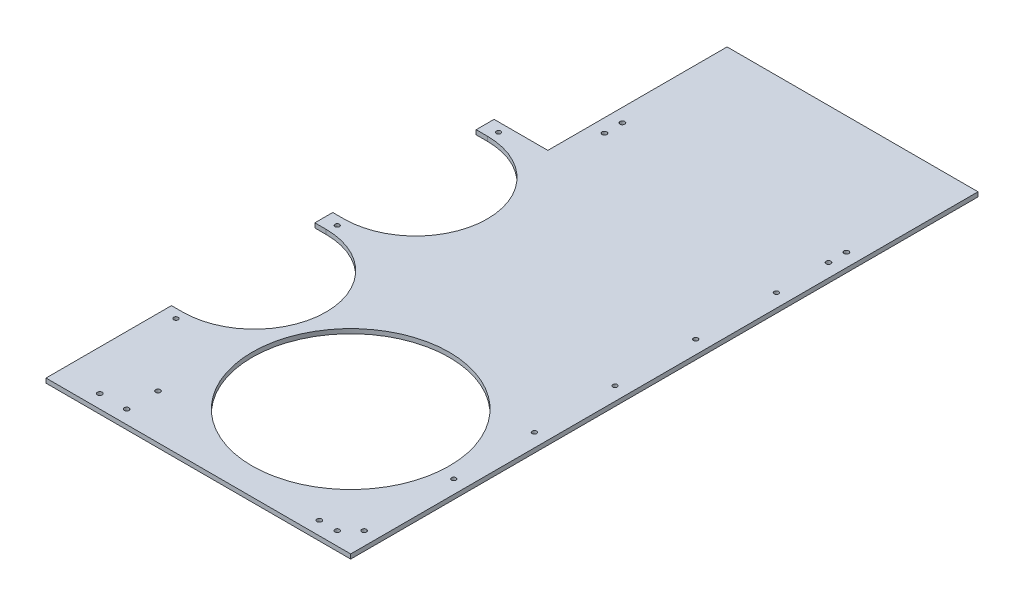
ISO-10303-21;
HEADER;
FILE_DESCRIPTION(('STEP AP214'),'2;1');
FILE_NAME('part.step','',(''),(''),'','','');
FILE_SCHEMA(('AUTOMOTIVE_DESIGN { 1 0 10303 214 1 1 1 1 }'));
ENDSEC;
DATA;
#1=APPLICATION_CONTEXT('core data for automotive mechanical design processes');
#2=APPLICATION_PROTOCOL_DEFINITION('international standard','automotive_design',2000,#1);
#3=PRODUCT_CONTEXT('',#1,'mechanical');
#4=PRODUCT('Part','Part','',(#3));
#5=PRODUCT_RELATED_PRODUCT_CATEGORY('part','',(#4));
#6=PRODUCT_DEFINITION_FORMATION('','',#4);
#7=PRODUCT_DEFINITION_CONTEXT('part definition',#1,'design');
#8=PRODUCT_DEFINITION('design','',#6,#7);
#9=PRODUCT_DEFINITION_SHAPE('','',#8);
#10=(LENGTH_UNIT() NAMED_UNIT(*) SI_UNIT(.MILLI.,.METRE.));
#11=(NAMED_UNIT(*) PLANE_ANGLE_UNIT() SI_UNIT($,.RADIAN.));
#12=(NAMED_UNIT(*) SI_UNIT($,.STERADIAN.) SOLID_ANGLE_UNIT());
#13=UNCERTAINTY_MEASURE_WITH_UNIT(LENGTH_MEASURE(1.E-05),#10,'distance_accuracy_value','');
#14=(GEOMETRIC_REPRESENTATION_CONTEXT(3) GLOBAL_UNCERTAINTY_ASSIGNED_CONTEXT((#13)) GLOBAL_UNIT_ASSIGNED_CONTEXT((#10,
#11,#12)) REPRESENTATION_CONTEXT('',''));
#15=CARTESIAN_POINT('',(0.,0.,0.));
#16=DIRECTION('',(0.,0.,1.));
#17=DIRECTION('',(1.,0.,0.));
#18=AXIS2_PLACEMENT_3D('',#15,#16,#17);
#19=CARTESIAN_POINT('',(-120.649999995191,-981.98828343336,374.650000000872));
#20=DIRECTION('',(0.,1.,0.));
#21=DIRECTION('',(1.,0.,0.));
#22=AXIS2_PLACEMENT_3D('',#19,#20,#21);
#23=CYLINDRICAL_SURFACE('',#22,3.3782);
#24=CARTESIAN_POINT('',(-120.649999995191,0.,374.650000000872));
#25=DIRECTION('',(0.,1.,0.));
#26=DIRECTION('',(1.,0.,0.));
#27=AXIS2_PLACEMENT_3D('',#24,#25,#26);
#28=CIRCLE('',#27,3.3782);
#29=CARTESIAN_POINT('',(-117.271799995191,0.,374.650000000872));
#30=VERTEX_POINT('',#29);
#31=EDGE_CURVE('E285',#30,#30,#28,.T.);
#32=ORIENTED_EDGE('',*,*,#31,.F.);
#33=EDGE_LOOP('',(#32));
#34=FACE_BOUND('',#33,.T.);
#35=CARTESIAN_POINT('',(-120.649999995191,6.35000000000005,374.650000000872));
#36=DIRECTION('',(0.,-1.,0.));
#37=DIRECTION('',(0.,0.,-1.));
#38=AXIS2_PLACEMENT_3D('',#35,#36,#37);
#39=CIRCLE('',#38,3.3782);
#40=CARTESIAN_POINT('',(-120.649999995191,6.35000000000005,371.271800000872));
#41=VERTEX_POINT('',#40);
#42=EDGE_CURVE('E11',#41,#41,#39,.T.);
#43=ORIENTED_EDGE('',*,*,#42,.F.);
#44=EDGE_LOOP('',(#43));
#45=FACE_BOUND('',#44,.T.);
#46=ADVANCED_FACE('F16',(#34,#45),#23,.F.);
#47=CARTESIAN_POINT('',(-120.649999995512,-981.98828343336,330.200000000874));
#48=DIRECTION('',(0.,1.,0.));
#49=DIRECTION('',(1.,0.,0.));
#50=AXIS2_PLACEMENT_3D('',#47,#48,#49);
#51=CYLINDRICAL_SURFACE('',#50,3.3782);
#52=CARTESIAN_POINT('',(-120.649999995512,0.,330.200000000874));
#53=DIRECTION('',(0.,1.,0.));
#54=DIRECTION('',(1.,0.,0.));
#55=AXIS2_PLACEMENT_3D('',#52,#53,#54);
#56=CIRCLE('',#55,3.3782);
#57=CARTESIAN_POINT('',(-117.271799995512,0.,330.200000000874));
#58=VERTEX_POINT('',#57);
#59=EDGE_CURVE('E502',#58,#58,#56,.T.);
#60=ORIENTED_EDGE('',*,*,#59,.F.);
#61=EDGE_LOOP('',(#60));
#62=FACE_BOUND('',#61,.T.);
#63=CARTESIAN_POINT('',(-120.649999995512,6.35000000000005,330.200000000874));
#64=DIRECTION('',(0.,-1.,0.));
#65=DIRECTION('',(0.,0.,-1.));
#66=AXIS2_PLACEMENT_3D('',#63,#64,#65);
#67=CIRCLE('',#66,3.3782);
#68=CARTESIAN_POINT('',(-120.649999995512,6.35000000000005,326.821800000874));
#69=VERTEX_POINT('',#68);
#70=EDGE_CURVE('E26',#69,#69,#67,.T.);
#71=ORIENTED_EDGE('',*,*,#70,.F.);
#72=EDGE_LOOP('',(#71));
#73=FACE_BOUND('',#72,.T.);
#74=ADVANCED_FACE('F342',(#62,#73),#51,.F.);
#75=CARTESIAN_POINT('',(-158.749999995189,-981.98828343336,374.650000001147));
#76=DIRECTION('',(0.,1.,0.));
#77=DIRECTION('',(1.,0.,0.));
#78=AXIS2_PLACEMENT_3D('',#75,#76,#77);
#79=CYLINDRICAL_SURFACE('',#78,3.3782);
#80=CARTESIAN_POINT('',(-158.749999995189,0.,374.650000001147));
#81=DIRECTION('',(0.,1.,0.));
#82=DIRECTION('',(1.,0.,0.));
#83=AXIS2_PLACEMENT_3D('',#80,#81,#82);
#84=CIRCLE('',#83,3.3782);
#85=CARTESIAN_POINT('',(-155.371799995189,0.,374.650000001147));
#86=VERTEX_POINT('',#85);
#87=EDGE_CURVE('E497',#86,#86,#84,.T.);
#88=ORIENTED_EDGE('',*,*,#87,.F.);
#89=EDGE_LOOP('',(#88));
#90=FACE_BOUND('',#89,.T.);
#91=CARTESIAN_POINT('',(-158.749999995189,6.35000000000005,374.650000001147));
#92=DIRECTION('',(0.,-1.,0.));
#93=DIRECTION('',(0.,0.,-1.));
#94=AXIS2_PLACEMENT_3D('',#91,#92,#93);
#95=CIRCLE('',#94,3.3782);
#96=CARTESIAN_POINT('',(-158.749999995189,6.35000000000005,371.271800001147));
#97=VERTEX_POINT('',#96);
#98=EDGE_CURVE('E494',#97,#97,#95,.T.);
#99=ORIENTED_EDGE('',*,*,#98,.F.);
#100=EDGE_LOOP('',(#99));
#101=FACE_BOUND('',#100,.T.);
#102=ADVANCED_FACE('F348',(#90,#101),#79,.F.);
#103=CARTESIAN_POINT('',(196.850000004656,-981.98828343336,355.599999998581));
#104=DIRECTION('',(0.,1.,0.));
#105=DIRECTION('',(1.,0.,0.));
#106=AXIS2_PLACEMENT_3D('',#103,#104,#105);
#107=CYLINDRICAL_SURFACE('',#106,3.3782);
#108=CARTESIAN_POINT('',(196.850000004656,0.,355.599999998581));
#109=DIRECTION('',(0.,1.,0.));
#110=DIRECTION('',(1.,0.,0.));
#111=AXIS2_PLACEMENT_3D('',#108,#109,#110);
#112=CIRCLE('',#111,3.3782);
#113=CARTESIAN_POINT('',(200.228200004656,0.,355.599999998581));
#114=VERTEX_POINT('',#113);
#115=EDGE_CURVE('E491',#114,#114,#112,.T.);
#116=ORIENTED_EDGE('',*,*,#115,.F.);
#117=EDGE_LOOP('',(#116));
#118=FACE_BOUND('',#117,.T.);
#119=CARTESIAN_POINT('',(196.850000004656,6.35000000000005,355.599999998581));
#120=DIRECTION('',(0.,-1.,0.));
#121=DIRECTION('',(0.,0.,-1.));
#122=AXIS2_PLACEMENT_3D('',#119,#120,#121);
#123=CIRCLE('',#122,3.3782);
#124=CARTESIAN_POINT('',(196.850000004656,6.35000000000005,352.221799998581));
#125=VERTEX_POINT('',#124);
#126=EDGE_CURVE('E488',#125,#125,#123,.T.);
#127=ORIENTED_EDGE('',*,*,#126,.F.);
#128=EDGE_LOOP('',(#127));
#129=FACE_BOUND('',#128,.T.);
#130=ADVANCED_FACE('F356',(#118,#129),#107,.F.);
#131=CARTESIAN_POINT('',(177.800000004794,-981.98828343336,374.649999998718));
#132=DIRECTION('',(0.,1.,0.));
#133=DIRECTION('',(1.,0.,0.));
#134=AXIS2_PLACEMENT_3D('',#131,#132,#133);
#135=CYLINDRICAL_SURFACE('',#134,3.3782);
#136=CARTESIAN_POINT('',(177.800000004794,0.,374.649999998718));
#137=DIRECTION('',(0.,1.,0.));
#138=DIRECTION('',(1.,0.,0.));
#139=AXIS2_PLACEMENT_3D('',#136,#137,#138);
#140=CIRCLE('',#139,3.3782);
#141=CARTESIAN_POINT('',(181.178200004794,0.,374.649999998718));
#142=VERTEX_POINT('',#141);
#143=EDGE_CURVE('E485',#142,#142,#140,.T.);
#144=ORIENTED_EDGE('',*,*,#143,.F.);
#145=EDGE_LOOP('',(#144));
#146=FACE_BOUND('',#145,.T.);
#147=CARTESIAN_POINT('',(177.800000004794,6.35000000000005,374.649999998718));
#148=DIRECTION('',(0.,-1.,0.));
#149=DIRECTION('',(0.,0.,-1.));
#150=AXIS2_PLACEMENT_3D('',#147,#148,#149);
#151=CIRCLE('',#150,3.3782);
#152=CARTESIAN_POINT('',(177.800000004794,6.35000000000005,371.271799998718));
#153=VERTEX_POINT('',#152);
#154=EDGE_CURVE('E482',#153,#153,#151,.T.);
#155=ORIENTED_EDGE('',*,*,#154,.F.);
#156=EDGE_LOOP('',(#155));
#157=FACE_BOUND('',#156,.T.);
#158=ADVANCED_FACE('F360',(#146,#157),#135,.F.);
#159=CARTESIAN_POINT('',(152.400000004795,-981.98828343336,374.649999998901));
#160=DIRECTION('',(0.,1.,0.));
#161=DIRECTION('',(1.,0.,0.));
#162=AXIS2_PLACEMENT_3D('',#159,#160,#161);
#163=CYLINDRICAL_SURFACE('',#162,3.3782);
#164=CARTESIAN_POINT('',(152.400000004795,0.,374.649999998901));
#165=DIRECTION('',(0.,1.,0.));
#166=DIRECTION('',(1.,0.,0.));
#167=AXIS2_PLACEMENT_3D('',#164,#165,#166);
#168=CIRCLE('',#167,3.3782);
#169=CARTESIAN_POINT('',(155.778200004795,0.,374.649999998901));
#170=VERTEX_POINT('',#169);
#171=EDGE_CURVE('E479',#170,#170,#168,.T.);
#172=ORIENTED_EDGE('',*,*,#171,.F.);
#173=EDGE_LOOP('',(#172));
#174=FACE_BOUND('',#173,.T.);
#175=CARTESIAN_POINT('',(152.400000004795,6.35000000000005,374.649999998901));
#176=DIRECTION('',(0.,-1.,0.));
#177=DIRECTION('',(0.,0.,-1.));
#178=AXIS2_PLACEMENT_3D('',#175,#176,#177);
#179=CIRCLE('',#178,3.3782);
#180=CARTESIAN_POINT('',(152.400000004795,6.35000000000005,371.271799998901));
#181=VERTEX_POINT('',#180);
#182=EDGE_CURVE('E476',#181,#181,#179,.T.);
#183=ORIENTED_EDGE('',*,*,#182,.F.);
#184=EDGE_LOOP('',(#183));
#185=FACE_BOUND('',#184,.T.);
#186=ADVANCED_FACE('F364',(#174,#185),#163,.F.);
#187=CARTESIAN_POINT('',(196.850000000001,-981.98828343336,-327.909418016134));
#188=DIRECTION('',(0.,1.,0.));
#189=DIRECTION('',(1.,0.,0.));
#190=AXIS2_PLACEMENT_3D('',#187,#188,#189);
#191=CYLINDRICAL_SURFACE('',#190,3.3782);
#192=CARTESIAN_POINT('',(196.850000000001,0.,-327.909418016134));
#193=DIRECTION('',(0.,1.,0.));
#194=DIRECTION('',(1.,0.,0.));
#195=AXIS2_PLACEMENT_3D('',#192,#193,#194);
#196=CIRCLE('',#195,3.3782);
#197=CARTESIAN_POINT('',(200.228200000001,0.,-327.909418016134));
#198=VERTEX_POINT('',#197);
#199=EDGE_CURVE('E473',#198,#198,#196,.T.);
#200=ORIENTED_EDGE('',*,*,#199,.F.);
#201=EDGE_LOOP('',(#200));
#202=FACE_BOUND('',#201,.T.);
#203=CARTESIAN_POINT('',(196.850000000001,6.35000000000005,-327.909418016134));
#204=DIRECTION('',(0.,-1.,0.));
#205=DIRECTION('',(0.,0.,-1.));
#206=AXIS2_PLACEMENT_3D('',#203,#204,#205);
#207=CIRCLE('',#206,3.3782);
#208=CARTESIAN_POINT('',(196.850000000001,6.35000000000005,-331.287618016134));
#209=VERTEX_POINT('',#208);
#210=EDGE_CURVE('E470',#209,#209,#207,.T.);
#211=ORIENTED_EDGE('',*,*,#210,.F.);
#212=EDGE_LOOP('',(#211));
#213=FACE_BOUND('',#212,.T.);
#214=ADVANCED_FACE('F368',(#202,#213),#191,.F.);
#215=CARTESIAN_POINT('',(196.850000000001,-981.98828343336,-302.509418016135));
#216=DIRECTION('',(0.,1.,0.));
#217=DIRECTION('',(1.,0.,0.));
#218=AXIS2_PLACEMENT_3D('',#215,#216,#217);
#219=CYLINDRICAL_SURFACE('',#218,3.3782);
#220=CARTESIAN_POINT('',(196.850000000001,0.,-302.509418016135));
#221=DIRECTION('',(0.,1.,0.));
#222=DIRECTION('',(1.,0.,0.));
#223=AXIS2_PLACEMENT_3D('',#220,#221,#222);
#224=CIRCLE('',#223,3.3782);
#225=CARTESIAN_POINT('',(200.228200000001,0.,-302.509418016135));
#226=VERTEX_POINT('',#225);
#227=EDGE_CURVE('E467',#226,#226,#224,.T.);
#228=ORIENTED_EDGE('',*,*,#227,.F.);
#229=EDGE_LOOP('',(#228));
#230=FACE_BOUND('',#229,.T.);
#231=CARTESIAN_POINT('',(196.850000000001,6.35000000000005,-302.509418016135));
#232=DIRECTION('',(0.,-1.,0.));
#233=DIRECTION('',(0.,0.,-1.));
#234=AXIS2_PLACEMENT_3D('',#231,#232,#233);
#235=CIRCLE('',#234,3.3782);
#236=CARTESIAN_POINT('',(196.850000000001,6.35000000000005,-305.887618016135));
#237=VERTEX_POINT('',#236);
#238=EDGE_CURVE('E464',#237,#237,#235,.T.);
#239=ORIENTED_EDGE('',*,*,#238,.F.);
#240=EDGE_LOOP('',(#239));
#241=FACE_BOUND('',#240,.T.);
#242=ADVANCED_FACE('F372',(#230,#241),#219,.F.);
#243=CARTESIAN_POINT('',(-120.650000005025,-981.98828343336,-302.509418013899));
#244=DIRECTION('',(0.,1.,0.));
#245=DIRECTION('',(1.,0.,0.));
#246=AXIS2_PLACEMENT_3D('',#243,#244,#245);
#247=CYLINDRICAL_SURFACE('',#246,3.3782);
#248=CARTESIAN_POINT('',(-120.650000005025,0.,-302.509418013899));
#249=DIRECTION('',(0.,1.,0.));
#250=DIRECTION('',(1.,0.,0.));
#251=AXIS2_PLACEMENT_3D('',#248,#249,#250);
#252=CIRCLE('',#251,3.3782);
#253=CARTESIAN_POINT('',(-117.271800005025,0.,-302.509418013899));
#254=VERTEX_POINT('',#253);
#255=EDGE_CURVE('E461',#254,#254,#252,.T.);
#256=ORIENTED_EDGE('',*,*,#255,.F.);
#257=EDGE_LOOP('',(#256));
#258=FACE_BOUND('',#257,.T.);
#259=CARTESIAN_POINT('',(-120.650000005025,6.35000000000005,-302.509418013899));
#260=DIRECTION('',(0.,-1.,0.));
#261=DIRECTION('',(0.,0.,-1.));
#262=AXIS2_PLACEMENT_3D('',#259,#260,#261);
#263=CIRCLE('',#262,3.3782);
#264=CARTESIAN_POINT('',(-120.650000005025,6.35000000000005,-305.887618013899));
#265=VERTEX_POINT('',#264);
#266=EDGE_CURVE('E454',#265,#265,#263,.T.);
#267=ORIENTED_EDGE('',*,*,#266,.F.);
#268=EDGE_LOOP('',(#267));
#269=FACE_BOUND('',#268,.T.);
#270=ADVANCED_FACE('F376',(#258,#269),#247,.F.);
#271=CARTESIAN_POINT('',(-120.650000005209,-981.98828343336,-327.909418013897));
#272=DIRECTION('',(0.,1.,0.));
#273=DIRECTION('',(1.,0.,0.));
#274=AXIS2_PLACEMENT_3D('',#271,#272,#273);
#275=CYLINDRICAL_SURFACE('',#274,3.3782);
#276=CARTESIAN_POINT('',(-120.650000005209,0.,-327.909418013897));
#277=DIRECTION('',(0.,1.,0.));
#278=DIRECTION('',(1.,0.,0.));
#279=AXIS2_PLACEMENT_3D('',#276,#277,#278);
#280=CIRCLE('',#279,3.3782);
#281=CARTESIAN_POINT('',(-117.271800005209,0.,-327.909418013897));
#282=VERTEX_POINT('',#281);
#283=EDGE_CURVE('E457',#282,#282,#280,.T.);
#284=ORIENTED_EDGE('',*,*,#283,.F.);
#285=EDGE_LOOP('',(#284));
#286=FACE_BOUND('',#285,.T.);
#287=CARTESIAN_POINT('',(-120.650000005209,6.35000000000005,-327.909418013897));
#288=DIRECTION('',(0.,-1.,0.));
#289=DIRECTION('',(0.,0.,-1.));
#290=AXIS2_PLACEMENT_3D('',#287,#288,#289);
#291=CIRCLE('',#290,3.3782);
#292=CARTESIAN_POINT('',(-120.650000005209,6.35000000000005,-331.287618013897));
#293=VERTEX_POINT('',#292);
#294=EDGE_CURVE('E452',#293,#293,#291,.T.);
#295=ORIENTED_EDGE('',*,*,#294,.F.);
#296=EDGE_LOOP('',(#295));
#297=FACE_BOUND('',#296,.T.);
#298=ADVANCED_FACE('F380',(#286,#297),#275,.F.);
#299=CARTESIAN_POINT('',(38.1,6.35,215.9));
#300=DIRECTION('',(0.,-1.,0.));
#301=DIRECTION('',(0.,0.,-1.));
#302=AXIS2_PLACEMENT_3D('',#299,#300,#301);
#303=CYLINDRICAL_SURFACE('',#302,139.7);
#304=CARTESIAN_POINT('',(38.1,0.,215.9));
#305=DIRECTION('',(0.,1.,0.));
#306=DIRECTION('',(1.,0.,0.));
#307=AXIS2_PLACEMENT_3D('',#304,#305,#306);
#308=CIRCLE('',#307,139.7);
#309=CARTESIAN_POINT('',(177.8,0.,215.9));
#310=VERTEX_POINT('',#309);
#311=EDGE_CURVE('E217',#310,#310,#308,.T.);
#312=ORIENTED_EDGE('',*,*,#311,.F.);
#313=EDGE_LOOP('',(#312));
#314=FACE_BOUND('',#313,.T.);
#315=CARTESIAN_POINT('',(38.1,6.35,215.9));
#316=DIRECTION('',(0.,-1.,0.));
#317=DIRECTION('',(0.,0.,-1.));
#318=AXIS2_PLACEMENT_3D('',#315,#316,#317);
#319=CIRCLE('',#318,139.7);
#320=CARTESIAN_POINT('',(38.1,6.35,76.2));
#321=VERTEX_POINT('',#320);
#322=EDGE_CURVE('E227',#321,#321,#319,.T.);
#323=ORIENTED_EDGE('',*,*,#322,.F.);
#324=EDGE_LOOP('',(#323));
#325=FACE_BOUND('',#324,.T.);
#326=ADVANCED_FACE('F384',(#314,#325),#303,.F.);
#327=CARTESIAN_POINT('',(215.9,6.35,-495.3));
#328=DIRECTION('',(0.,0.,1.));
#329=DIRECTION('',(1.,0.,0.));
#330=AXIS2_PLACEMENT_3D('',#327,#328,#329);
#331=PLANE('',#330);
#332=DIRECTION('',(-1.,0.,0.));
#333=VECTOR('',#332,1.);
#334=CARTESIAN_POINT('',(107.95,6.35,-495.3));
#335=LINE('',#334,#333);
#336=CARTESIAN_POINT('',(215.9,6.35,-495.3));
#337=VERTEX_POINT('',#336);
#338=CARTESIAN_POINT('',(-139.700000006232,6.35,-495.3));
#339=VERTEX_POINT('',#338);
#340=EDGE_CURVE('E213',#337,#339,#335,.T.);
#341=ORIENTED_EDGE('',*,*,#340,.F.);
#342=DIRECTION('',(0.,1.,0.));
#343=VECTOR('',#342,1.);
#344=CARTESIAN_POINT('',(215.9,3.175,-495.3));
#345=LINE('',#344,#343);
#346=CARTESIAN_POINT('',(215.9,0.,-495.3));
#347=VERTEX_POINT('',#346);
#348=EDGE_CURVE('E35',#347,#337,#345,.T.);
#349=ORIENTED_EDGE('',*,*,#348,.F.);
#350=DIRECTION('',(1.,0.,0.));
#351=VECTOR('',#350,1.);
#352=CARTESIAN_POINT('',(107.95,0.,-495.3));
#353=LINE('',#352,#351);
#354=CARTESIAN_POINT('',(-139.700000006232,0.,-495.3));
#355=VERTEX_POINT('',#354);
#356=EDGE_CURVE('E215',#355,#347,#353,.T.);
#357=ORIENTED_EDGE('',*,*,#356,.F.);
#358=DIRECTION('',(0.,-1.,0.));
#359=VECTOR('',#358,1.);
#360=CARTESIAN_POINT('',(-139.700000006232,6.35,-495.3));
#361=LINE('',#360,#359);
#362=EDGE_CURVE('E219',#339,#355,#361,.T.);
#363=ORIENTED_EDGE('',*,*,#362,.F.);
#364=EDGE_LOOP('',(#341,#349,#357,#363));
#365=FACE_BOUND('',#364,.T.);
#366=ADVANCED_FACE('F320',(#365),#331,.F.);
#367=CARTESIAN_POINT('',(0.,6.35,0.));
#368=DIRECTION('',(0.,1.,0.));
#369=DIRECTION('',(0.,0.,1.));
#370=AXIS2_PLACEMENT_3D('',#367,#368,#369);
#371=PLANE('',#370);
#372=ORIENTED_EDGE('',*,*,#42,.T.);
#373=EDGE_LOOP('',(#372));
#374=FACE_BOUND('',#373,.T.);
#375=ORIENTED_EDGE('',*,*,#70,.T.);
#376=EDGE_LOOP('',(#375));
#377=FACE_BOUND('',#376,.T.);
#378=ORIENTED_EDGE('',*,*,#98,.T.);
#379=EDGE_LOOP('',(#378));
#380=FACE_BOUND('',#379,.T.);
#381=ORIENTED_EDGE('',*,*,#126,.T.);
#382=EDGE_LOOP('',(#381));
#383=FACE_BOUND('',#382,.T.);
#384=ORIENTED_EDGE('',*,*,#154,.T.);
#385=EDGE_LOOP('',(#384));
#386=FACE_BOUND('',#385,.T.);
#387=ORIENTED_EDGE('',*,*,#182,.T.);
#388=EDGE_LOOP('',(#387));
#389=FACE_BOUND('',#388,.T.);
#390=ORIENTED_EDGE('',*,*,#210,.T.);
#391=EDGE_LOOP('',(#390));
#392=FACE_BOUND('',#391,.T.);
#393=ORIENTED_EDGE('',*,*,#238,.T.);
#394=EDGE_LOOP('',(#393));
#395=FACE_BOUND('',#394,.T.);
#396=ORIENTED_EDGE('',*,*,#266,.T.);
#397=EDGE_LOOP('',(#396));
#398=FACE_BOUND('',#397,.T.);
#399=ORIENTED_EDGE('',*,*,#294,.T.);
#400=EDGE_LOOP('',(#399));
#401=FACE_BOUND('',#400,.T.);
#402=ORIENTED_EDGE('',*,*,#322,.T.);
#403=EDGE_LOOP('',(#402));
#404=FACE_BOUND('',#403,.T.);
#405=CARTESIAN_POINT('',(-196.85,6.35000000000005,-228.6));
#406=DIRECTION('',(0.,-1.,0.));
#407=DIRECTION('',(0.,0.,-1.));
#408=AXIS2_PLACEMENT_3D('',#405,#406,#407);
#409=CIRCLE('',#408,3.175);
#410=CARTESIAN_POINT('',(-196.85,6.35000000000005,-231.775));
#411=VERTEX_POINT('',#410);
#412=EDGE_CURVE('E224',#411,#411,#409,.T.);
#413=ORIENTED_EDGE('',*,*,#412,.T.);
#414=EDGE_LOOP('',(#413));
#415=FACE_BOUND('',#414,.T.);
#416=CARTESIAN_POINT('',(-196.85,6.35000000000005,228.6));
#417=DIRECTION('',(0.,-1.,0.));
#418=DIRECTION('',(0.,0.,-1.));
#419=AXIS2_PLACEMENT_3D('',#416,#417,#418);
#420=CIRCLE('',#419,3.175);
#421=CARTESIAN_POINT('',(-196.85,6.35000000000005,225.425));
#422=VERTEX_POINT('',#421);
#423=EDGE_CURVE('E228',#422,#422,#420,.T.);
#424=ORIENTED_EDGE('',*,*,#423,.T.);
#425=EDGE_LOOP('',(#424));
#426=FACE_BOUND('',#425,.T.);
#427=CARTESIAN_POINT('',(-196.85,6.35000000000005,0.));
#428=DIRECTION('',(0.,-1.,0.));
#429=DIRECTION('',(0.,0.,-1.));
#430=AXIS2_PLACEMENT_3D('',#427,#428,#429);
#431=CIRCLE('',#430,3.175);
#432=CARTESIAN_POINT('',(-196.85,6.35000000000005,-3.175));
#433=VERTEX_POINT('',#432);
#434=EDGE_CURVE('E231',#433,#433,#431,.T.);
#435=ORIENTED_EDGE('',*,*,#434,.T.);
#436=EDGE_LOOP('',(#435));
#437=FACE_BOUND('',#436,.T.);
#438=CARTESIAN_POINT('',(196.85,6.35000000000005,-114.3));
#439=DIRECTION('',(0.,-1.,0.));
#440=DIRECTION('',(0.,0.,-1.));
#441=AXIS2_PLACEMENT_3D('',#438,#439,#440);
#442=CIRCLE('',#441,3.175);
#443=CARTESIAN_POINT('',(196.85,6.35000000000005,-117.475));
#444=VERTEX_POINT('',#443);
#445=EDGE_CURVE('E234',#444,#444,#442,.T.);
#446=ORIENTED_EDGE('',*,*,#445,.T.);
#447=EDGE_LOOP('',(#446));
#448=FACE_BOUND('',#447,.T.);
#449=CARTESIAN_POINT('',(196.85,6.35000000000005,228.6));
#450=DIRECTION('',(0.,-1.,0.));
#451=DIRECTION('',(0.,0.,-1.));
#452=AXIS2_PLACEMENT_3D('',#449,#450,#451);
#453=CIRCLE('',#452,3.175);
#454=CARTESIAN_POINT('',(196.85,6.35000000000005,225.425));
#455=VERTEX_POINT('',#454);
#456=EDGE_CURVE('E237',#455,#455,#453,.T.);
#457=ORIENTED_EDGE('',*,*,#456,.T.);
#458=EDGE_LOOP('',(#457));
#459=FACE_BOUND('',#458,.T.);
#460=CARTESIAN_POINT('',(196.85,6.35000000000005,-228.6));
#461=DIRECTION('',(0.,-1.,0.));
#462=DIRECTION('',(0.,0.,-1.));
#463=AXIS2_PLACEMENT_3D('',#460,#461,#462);
#464=CIRCLE('',#463,3.175);
#465=CARTESIAN_POINT('',(196.85,6.35000000000005,-231.775));
#466=VERTEX_POINT('',#465);
#467=EDGE_CURVE('E240',#466,#466,#464,.T.);
#468=ORIENTED_EDGE('',*,*,#467,.T.);
#469=EDGE_LOOP('',(#468));
#470=FACE_BOUND('',#469,.T.);
#471=CARTESIAN_POINT('',(196.85,6.35000000000005,0.));
#472=DIRECTION('',(0.,-1.,0.));
#473=DIRECTION('',(0.,0.,-1.));
#474=AXIS2_PLACEMENT_3D('',#471,#472,#473);
#475=CIRCLE('',#474,3.175);
#476=CARTESIAN_POINT('',(196.85,6.35000000000005,-3.175));
#477=VERTEX_POINT('',#476);
#478=EDGE_CURVE('E243',#477,#477,#475,.T.);
#479=ORIENTED_EDGE('',*,*,#478,.T.);
#480=EDGE_LOOP('',(#479));
#481=FACE_BOUND('',#480,.T.);
#482=CARTESIAN_POINT('',(196.85,6.35000000000005,114.3));
#483=DIRECTION('',(0.,-1.,0.));
#484=DIRECTION('',(0.,0.,-1.));
#485=AXIS2_PLACEMENT_3D('',#482,#483,#484);
#486=CIRCLE('',#485,3.175);
#487=CARTESIAN_POINT('',(196.85,6.35000000000005,111.125));
#488=VERTEX_POINT('',#487);
#489=EDGE_CURVE('E246',#488,#488,#486,.T.);
#490=ORIENTED_EDGE('',*,*,#489,.T.);
#491=EDGE_LOOP('',(#490));
#492=FACE_BOUND('',#491,.T.);
#493=ORIENTED_EDGE('',*,*,#340,.T.);
#494=DIRECTION('',(7.21670442440213E-12,0.,1.));
#495=VECTOR('',#494,1.);
#496=CARTESIAN_POINT('',(-139.700000004537,6.35,-260.349999999595));
#497=LINE('',#496,#495);
#498=CARTESIAN_POINT('',(-139.700000004399,6.35,-241.30000000055));
#499=VERTEX_POINT('',#498);
#500=EDGE_CURVE('E249',#339,#499,#497,.T.);
#501=ORIENTED_EDGE('',*,*,#500,.T.);
#502=DIRECTION('',(-1.,0.,7.21499267488344E-12));
#503=VECTOR('',#502,1.);
#504=CARTESIAN_POINT('',(-69.8500000030701,6.35,-241.300000001054));
#505=LINE('',#504,#503);
#506=CARTESIAN_POINT('',(-215.9,6.35,-241.3));
#507=VERTEX_POINT('',#506);
#508=EDGE_CURVE('E252',#499,#507,#505,.T.);
#509=ORIENTED_EDGE('',*,*,#508,.T.);
#510=DIRECTION('',(0.,0.,1.));
#511=VECTOR('',#510,1.);
#512=CARTESIAN_POINT('',(-215.9,6.35,279.4));
#513=LINE('',#512,#511);
#514=CARTESIAN_POINT('',(-215.9,6.35,-215.9));
#515=VERTEX_POINT('',#514);
#516=EDGE_CURVE('E255',#507,#515,#513,.T.);
#517=ORIENTED_EDGE('',*,*,#516,.T.);
#518=DIRECTION('',(1.,0.,0.));
#519=VECTOR('',#518,1.);
#520=CARTESIAN_POINT('',(-107.95,6.35,-215.9));
#521=LINE('',#520,#519);
#522=CARTESIAN_POINT('',(-200.025,6.35,-215.9));
#523=VERTEX_POINT('',#522);
#524=EDGE_CURVE('E141',#515,#523,#521,.T.);
#525=ORIENTED_EDGE('',*,*,#524,.T.);
#526=CARTESIAN_POINT('',(-200.025,6.35,-114.3));
#527=DIRECTION('',(0.,-1.,0.));
#528=DIRECTION('',(0.,0.,-1.));
#529=AXIS2_PLACEMENT_3D('',#526,#527,#528);
#530=CIRCLE('',#529,101.6);
#531=CARTESIAN_POINT('',(-200.025,6.35,-12.7));
#532=VERTEX_POINT('',#531);
#533=EDGE_CURVE('E171',#523,#532,#530,.T.);
#534=ORIENTED_EDGE('',*,*,#533,.T.);
#535=DIRECTION('',(-1.,0.,0.));
#536=VECTOR('',#535,1.);
#537=CARTESIAN_POINT('',(-100.0125,6.35,-12.7));
#538=LINE('',#537,#536);
#539=CARTESIAN_POINT('',(-215.9,6.35,-12.7));
#540=VERTEX_POINT('',#539);
#541=EDGE_CURVE('E168',#532,#540,#538,.T.);
#542=ORIENTED_EDGE('',*,*,#541,.T.);
#543=DIRECTION('',(0.,0.,1.));
#544=VECTOR('',#543,1.);
#545=CARTESIAN_POINT('',(-215.9,6.35,279.4));
#546=LINE('',#545,#544);
#547=CARTESIAN_POINT('',(-215.9,6.35,12.7));
#548=VERTEX_POINT('',#547);
#549=EDGE_CURVE('E260',#540,#548,#546,.T.);
#550=ORIENTED_EDGE('',*,*,#549,.T.);
#551=DIRECTION('',(1.,0.,0.));
#552=VECTOR('',#551,1.);
#553=CARTESIAN_POINT('',(-107.95,6.35,12.7));
#554=LINE('',#553,#552);
#555=CARTESIAN_POINT('',(-200.025,6.35,12.7));
#556=VERTEX_POINT('',#555);
#557=EDGE_CURVE('E263',#548,#556,#554,.T.);
#558=ORIENTED_EDGE('',*,*,#557,.T.);
#559=CARTESIAN_POINT('',(-200.025,6.35,114.3));
#560=DIRECTION('',(0.,-1.,0.));
#561=DIRECTION('',(0.,0.,-1.));
#562=AXIS2_PLACEMENT_3D('',#559,#560,#561);
#563=CIRCLE('',#562,101.6);
#564=CARTESIAN_POINT('',(-200.025,6.35,215.9));
#565=VERTEX_POINT('',#564);
#566=EDGE_CURVE('E266',#556,#565,#563,.T.);
#567=ORIENTED_EDGE('',*,*,#566,.T.);
#568=DIRECTION('',(-1.,0.,0.));
#569=VECTOR('',#568,1.);
#570=CARTESIAN_POINT('',(-100.0125,6.35,215.9));
#571=LINE('',#570,#569);
#572=CARTESIAN_POINT('',(-215.9,6.35,215.9));
#573=VERTEX_POINT('',#572);
#574=EDGE_CURVE('E269',#565,#573,#571,.T.);
#575=ORIENTED_EDGE('',*,*,#574,.T.);
#576=DIRECTION('',(0.,0.,1.));
#577=VECTOR('',#576,1.);
#578=CARTESIAN_POINT('',(-215.9,6.35,368.3));
#579=LINE('',#578,#577);
#580=CARTESIAN_POINT('',(-215.9,6.35,393.7));
#581=VERTEX_POINT('',#580);
#582=EDGE_CURVE('E272',#573,#581,#579,.T.);
#583=ORIENTED_EDGE('',*,*,#582,.T.);
#584=DIRECTION('',(-1.,0.,0.));
#585=VECTOR('',#584,1.);
#586=CARTESIAN_POINT('',(215.9,6.35,393.7));
#587=LINE('',#586,#585);
#588=CARTESIAN_POINT('',(215.9,6.35,393.7));
#589=VERTEX_POINT('',#588);
#590=EDGE_CURVE('E223',#589,#581,#587,.T.);
#591=ORIENTED_EDGE('',*,*,#590,.F.);
#592=DIRECTION('',(0.,0.,-1.));
#593=VECTOR('',#592,1.);
#594=CARTESIAN_POINT('',(215.9,6.35,-241.3));
#595=LINE('',#594,#593);
#596=EDGE_CURVE('E222',#589,#337,#595,.T.);
#597=ORIENTED_EDGE('',*,*,#596,.T.);
#598=EDGE_LOOP('',(#493,#501,#509,#517,#525,#534,#542,#550,#558,#567,#575,#583,#591,#597));
#599=FACE_BOUND('',#598,.T.);
#600=ADVANCED_FACE('F312',(#374,#377,#380,#383,#386,#389,#392,#395,#398,#401,#404,#415,#426,
#437,#448,#459,#470,#481,#492,#599),#371,.T.);
#601=CARTESIAN_POINT('',(-139.700000006416,6.35,-520.700000000197));
#602=DIRECTION('',(1.,0.,-7.21670442440213E-12));
#603=DIRECTION('',(-7.21670442440213E-12,0.,-1.));
#604=AXIS2_PLACEMENT_3D('',#601,#602,#603);
#605=PLANE('',#604);
#606=ORIENTED_EDGE('',*,*,#362,.T.);
#607=DIRECTION('',(-7.21670442440213E-12,0.,-1.));
#608=VECTOR('',#607,1.);
#609=CARTESIAN_POINT('',(-139.700000004537,0.,-260.349999999595));
#610=LINE('',#609,#608);
#611=CARTESIAN_POINT('',(-139.700000004399,0.,-241.30000000055));
#612=VERTEX_POINT('',#611);
#613=EDGE_CURVE('E184',#612,#355,#610,.T.);
#614=ORIENTED_EDGE('',*,*,#613,.F.);
#615=DIRECTION('',(0.,-1.,0.));
#616=VECTOR('',#615,1.);
#617=CARTESIAN_POINT('',(-139.700000004399,6.35,-241.30000000055));
#618=LINE('',#617,#616);
#619=EDGE_CURVE('E281',#499,#612,#618,.T.);
#620=ORIENTED_EDGE('',*,*,#619,.F.);
#621=ORIENTED_EDGE('',*,*,#500,.F.);
#622=EDGE_LOOP('',(#606,#614,#620,#621));
#623=FACE_BOUND('',#622,.T.);
#624=ADVANCED_FACE('F318',(#623),#605,.F.);
#625=CARTESIAN_POINT('',(0.,3.175,393.7));
#626=DIRECTION('',(0.,0.,1.));
#627=DIRECTION('',(1.,0.,0.));
#628=AXIS2_PLACEMENT_3D('',#625,#626,#627);
#629=PLANE('',#628);
#630=ORIENTED_EDGE('',*,*,#590,.T.);
#631=DIRECTION('',(0.,-1.,0.));
#632=VECTOR('',#631,1.);
#633=CARTESIAN_POINT('',(-215.9,6.35,393.7));
#634=LINE('',#633,#632);
#635=CARTESIAN_POINT('',(-215.9,0.,393.7));
#636=VERTEX_POINT('',#635);
#637=EDGE_CURVE('E276',#581,#636,#634,.T.);
#638=ORIENTED_EDGE('',*,*,#637,.T.);
#639=DIRECTION('',(1.,0.,0.));
#640=VECTOR('',#639,1.);
#641=CARTESIAN_POINT('',(-215.9,0.,393.7));
#642=LINE('',#641,#640);
#643=CARTESIAN_POINT('',(215.9,0.,393.7));
#644=VERTEX_POINT('',#643);
#645=EDGE_CURVE('E288',#636,#644,#642,.T.);
#646=ORIENTED_EDGE('',*,*,#645,.T.);
#647=DIRECTION('',(0.,1.,0.));
#648=VECTOR('',#647,1.);
#649=CARTESIAN_POINT('',(215.9,0.,393.7));
#650=LINE('',#649,#648);
#651=EDGE_CURVE('E284',#644,#589,#650,.T.);
#652=ORIENTED_EDGE('',*,*,#651,.T.);
#653=EDGE_LOOP('',(#630,#638,#646,#652));
#654=FACE_BOUND('',#653,.T.);
#655=ADVANCED_FACE('F323',(#654),#629,.T.);
#656=CARTESIAN_POINT('',(-139.700000004399,6.35,-241.30000000055));
#657=DIRECTION('',(7.21499267488344E-12,0.,1.));
#658=DIRECTION('',(1.,0.,-7.21499267488344E-12));
#659=AXIS2_PLACEMENT_3D('',#656,#657,#658);
#660=PLANE('',#659);
#661=ORIENTED_EDGE('',*,*,#508,.F.);
#662=ORIENTED_EDGE('',*,*,#619,.T.);
#663=DIRECTION('',(1.,0.,-7.21499267488344E-12));
#664=VECTOR('',#663,1.);
#665=CARTESIAN_POINT('',(-69.8500000030701,0.,-241.300000001054));
#666=LINE('',#665,#664);
#667=CARTESIAN_POINT('',(-215.9,0.,-241.3));
#668=VERTEX_POINT('',#667);
#669=EDGE_CURVE('E130',#668,#612,#666,.T.);
#670=ORIENTED_EDGE('',*,*,#669,.F.);
#671=DIRECTION('',(0.,-1.,0.));
#672=VECTOR('',#671,1.);
#673=CARTESIAN_POINT('',(-215.9,3.175,-241.3));
#674=LINE('',#673,#672);
#675=EDGE_CURVE('E126',#507,#668,#674,.T.);
#676=ORIENTED_EDGE('',*,*,#675,.F.);
#677=EDGE_LOOP('',(#661,#662,#670,#676));
#678=FACE_BOUND('',#677,.T.);
#679=ADVANCED_FACE('F316',(#678),#660,.F.);
#680=CARTESIAN_POINT('',(0.,0.,0.));
#681=DIRECTION('',(0.,1.,0.));
#682=DIRECTION('',(0.,0.,1.));
#683=AXIS2_PLACEMENT_3D('',#680,#681,#682);
#684=PLANE('',#683);
#685=ORIENTED_EDGE('',*,*,#31,.T.);
#686=EDGE_LOOP('',(#685));
#687=FACE_BOUND('',#686,.T.);
#688=ORIENTED_EDGE('',*,*,#59,.T.);
#689=EDGE_LOOP('',(#688));
#690=FACE_BOUND('',#689,.T.);
#691=ORIENTED_EDGE('',*,*,#87,.T.);
#692=EDGE_LOOP('',(#691));
#693=FACE_BOUND('',#692,.T.);
#694=ORIENTED_EDGE('',*,*,#115,.T.);
#695=EDGE_LOOP('',(#694));
#696=FACE_BOUND('',#695,.T.);
#697=ORIENTED_EDGE('',*,*,#143,.T.);
#698=EDGE_LOOP('',(#697));
#699=FACE_BOUND('',#698,.T.);
#700=ORIENTED_EDGE('',*,*,#171,.T.);
#701=EDGE_LOOP('',(#700));
#702=FACE_BOUND('',#701,.T.);
#703=ORIENTED_EDGE('',*,*,#199,.T.);
#704=EDGE_LOOP('',(#703));
#705=FACE_BOUND('',#704,.T.);
#706=ORIENTED_EDGE('',*,*,#227,.T.);
#707=EDGE_LOOP('',(#706));
#708=FACE_BOUND('',#707,.T.);
#709=ORIENTED_EDGE('',*,*,#255,.T.);
#710=EDGE_LOOP('',(#709));
#711=FACE_BOUND('',#710,.T.);
#712=ORIENTED_EDGE('',*,*,#283,.T.);
#713=EDGE_LOOP('',(#712));
#714=FACE_BOUND('',#713,.T.);
#715=ORIENTED_EDGE('',*,*,#311,.T.);
#716=EDGE_LOOP('',(#715));
#717=FACE_BOUND('',#716,.T.);
#718=ORIENTED_EDGE('',*,*,#356,.T.);
#719=DIRECTION('',(0.,0.,1.));
#720=VECTOR('',#719,1.);
#721=CARTESIAN_POINT('',(215.9,0.,368.3));
#722=LINE('',#721,#720);
#723=EDGE_CURVE('E218',#347,#644,#722,.T.);
#724=ORIENTED_EDGE('',*,*,#723,.T.);
#725=ORIENTED_EDGE('',*,*,#645,.F.);
#726=DIRECTION('',(0.,0.,-1.));
#727=VECTOR('',#726,1.);
#728=CARTESIAN_POINT('',(-215.9,0.,279.4));
#729=LINE('',#728,#727);
#730=CARTESIAN_POINT('',(-215.9,0.,215.9));
#731=VERTEX_POINT('',#730);
#732=EDGE_CURVE('E296',#636,#731,#729,.T.);
#733=ORIENTED_EDGE('',*,*,#732,.T.);
#734=DIRECTION('',(1.,0.,0.));
#735=VECTOR('',#734,1.);
#736=CARTESIAN_POINT('',(-100.0125,0.,215.9));
#737=LINE('',#736,#735);
#738=CARTESIAN_POINT('',(-200.025,0.,215.9));
#739=VERTEX_POINT('',#738);
#740=EDGE_CURVE('E299',#731,#739,#737,.T.);
#741=ORIENTED_EDGE('',*,*,#740,.T.);
#742=CARTESIAN_POINT('',(-200.025,0.,114.3));
#743=DIRECTION('',(0.,1.,0.));
#744=DIRECTION('',(1.,0.,0.));
#745=AXIS2_PLACEMENT_3D('',#742,#743,#744);
#746=CIRCLE('',#745,101.6);
#747=CARTESIAN_POINT('',(-200.025,0.,12.7));
#748=VERTEX_POINT('',#747);
#749=EDGE_CURVE('E302',#739,#748,#746,.T.);
#750=ORIENTED_EDGE('',*,*,#749,.T.);
#751=DIRECTION('',(-1.,0.,0.));
#752=VECTOR('',#751,1.);
#753=CARTESIAN_POINT('',(-107.95,0.,12.7));
#754=LINE('',#753,#752);
#755=CARTESIAN_POINT('',(-215.9,0.,12.7));
#756=VERTEX_POINT('',#755);
#757=EDGE_CURVE('E177',#748,#756,#754,.T.);
#758=ORIENTED_EDGE('',*,*,#757,.T.);
#759=DIRECTION('',(0.,0.,-1.));
#760=VECTOR('',#759,1.);
#761=CARTESIAN_POINT('',(-215.9,0.,279.4));
#762=LINE('',#761,#760);
#763=CARTESIAN_POINT('',(-215.9,0.,-12.7));
#764=VERTEX_POINT('',#763);
#765=EDGE_CURVE('E174',#756,#764,#762,.T.);
#766=ORIENTED_EDGE('',*,*,#765,.T.);
#767=DIRECTION('',(1.,0.,0.));
#768=VECTOR('',#767,1.);
#769=CARTESIAN_POINT('',(-100.0125,0.,-12.7));
#770=LINE('',#769,#768);
#771=CARTESIAN_POINT('',(-200.025,0.,-12.7));
#772=VERTEX_POINT('',#771);
#773=EDGE_CURVE('E165',#764,#772,#770,.T.);
#774=ORIENTED_EDGE('',*,*,#773,.T.);
#775=CARTESIAN_POINT('',(-200.025,0.,-114.3));
#776=DIRECTION('',(0.,1.,0.));
#777=DIRECTION('',(1.,0.,0.));
#778=AXIS2_PLACEMENT_3D('',#775,#776,#777);
#779=CIRCLE('',#778,101.6);
#780=CARTESIAN_POINT('',(-200.025,0.,-215.9));
#781=VERTEX_POINT('',#780);
#782=EDGE_CURVE('E136',#772,#781,#779,.T.);
#783=ORIENTED_EDGE('',*,*,#782,.T.);
#784=DIRECTION('',(-1.,0.,0.));
#785=VECTOR('',#784,1.);
#786=CARTESIAN_POINT('',(-107.95,0.,-215.9));
#787=LINE('',#786,#785);
#788=CARTESIAN_POINT('',(-215.9,0.,-215.9));
#789=VERTEX_POINT('',#788);
#790=EDGE_CURVE('E116',#781,#789,#787,.T.);
#791=ORIENTED_EDGE('',*,*,#790,.T.);
#792=DIRECTION('',(0.,0.,-1.));
#793=VECTOR('',#792,1.);
#794=CARTESIAN_POINT('',(-215.9,0.,279.4));
#795=LINE('',#794,#793);
#796=EDGE_CURVE('E122',#789,#668,#795,.T.);
#797=ORIENTED_EDGE('',*,*,#796,.T.);
#798=ORIENTED_EDGE('',*,*,#669,.T.);
#799=ORIENTED_EDGE('',*,*,#613,.T.);
#800=EDGE_LOOP('',(#718,#724,#725,#733,#741,#750,#758,#766,#774,#783,#791,#797,#798,#799));
#801=FACE_BOUND('',#800,.T.);
#802=CARTESIAN_POINT('',(-196.85,0.,-228.6));
#803=DIRECTION('',(0.,1.,0.));
#804=DIRECTION('',(1.,0.,0.));
#805=AXIS2_PLACEMENT_3D('',#802,#803,#804);
#806=CIRCLE('',#805,3.175);
#807=CARTESIAN_POINT('',(-193.675,0.,-228.6));
#808=VERTEX_POINT('',#807);
#809=EDGE_CURVE('E181',#808,#808,#806,.T.);
#810=ORIENTED_EDGE('',*,*,#809,.T.);
#811=EDGE_LOOP('',(#810));
#812=FACE_BOUND('',#811,.T.);
#813=CARTESIAN_POINT('',(-196.85,0.,228.6));
#814=DIRECTION('',(0.,1.,0.));
#815=DIRECTION('',(1.,0.,0.));
#816=AXIS2_PLACEMENT_3D('',#813,#814,#815);
#817=CIRCLE('',#816,3.175);
#818=CARTESIAN_POINT('',(-193.675,0.,228.6));
#819=VERTEX_POINT('',#818);
#820=EDGE_CURVE('E185',#819,#819,#817,.T.);
#821=ORIENTED_EDGE('',*,*,#820,.T.);
#822=EDGE_LOOP('',(#821));
#823=FACE_BOUND('',#822,.T.);
#824=CARTESIAN_POINT('',(-196.85,0.,0.));
#825=DIRECTION('',(0.,1.,0.));
#826=DIRECTION('',(1.,0.,0.));
#827=AXIS2_PLACEMENT_3D('',#824,#825,#826);
#828=CIRCLE('',#827,3.175);
#829=CARTESIAN_POINT('',(-193.675,0.,0.));
#830=VERTEX_POINT('',#829);
#831=EDGE_CURVE('E188',#830,#830,#828,.T.);
#832=ORIENTED_EDGE('',*,*,#831,.T.);
#833=EDGE_LOOP('',(#832));
#834=FACE_BOUND('',#833,.T.);
#835=CARTESIAN_POINT('',(196.85,0.,-114.3));
#836=DIRECTION('',(0.,1.,0.));
#837=DIRECTION('',(1.,0.,0.));
#838=AXIS2_PLACEMENT_3D('',#835,#836,#837);
#839=CIRCLE('',#838,3.175);
#840=CARTESIAN_POINT('',(200.025,0.,-114.3));
#841=VERTEX_POINT('',#840);
#842=EDGE_CURVE('E191',#841,#841,#839,.T.);
#843=ORIENTED_EDGE('',*,*,#842,.T.);
#844=EDGE_LOOP('',(#843));
#845=FACE_BOUND('',#844,.T.);
#846=CARTESIAN_POINT('',(196.85,0.,228.6));
#847=DIRECTION('',(0.,1.,0.));
#848=DIRECTION('',(1.,0.,0.));
#849=AXIS2_PLACEMENT_3D('',#846,#847,#848);
#850=CIRCLE('',#849,3.175);
#851=CARTESIAN_POINT('',(200.025,0.,228.6));
#852=VERTEX_POINT('',#851);
#853=EDGE_CURVE('E194',#852,#852,#850,.T.);
#854=ORIENTED_EDGE('',*,*,#853,.T.);
#855=EDGE_LOOP('',(#854));
#856=FACE_BOUND('',#855,.T.);
#857=CARTESIAN_POINT('',(196.85,0.,-228.6));
#858=DIRECTION('',(0.,1.,0.));
#859=DIRECTION('',(1.,0.,0.));
#860=AXIS2_PLACEMENT_3D('',#857,#858,#859);
#861=CIRCLE('',#860,3.175);
#862=CARTESIAN_POINT('',(200.025,0.,-228.6));
#863=VERTEX_POINT('',#862);
#864=EDGE_CURVE('E197',#863,#863,#861,.T.);
#865=ORIENTED_EDGE('',*,*,#864,.T.);
#866=EDGE_LOOP('',(#865));
#867=FACE_BOUND('',#866,.T.);
#868=CARTESIAN_POINT('',(196.85,0.,0.));
#869=DIRECTION('',(0.,1.,0.));
#870=DIRECTION('',(1.,0.,0.));
#871=AXIS2_PLACEMENT_3D('',#868,#869,#870);
#872=CIRCLE('',#871,3.175);
#873=CARTESIAN_POINT('',(200.025,0.,0.));
#874=VERTEX_POINT('',#873);
#875=EDGE_CURVE('E200',#874,#874,#872,.T.);
#876=ORIENTED_EDGE('',*,*,#875,.T.);
#877=EDGE_LOOP('',(#876));
#878=FACE_BOUND('',#877,.T.);
#879=CARTESIAN_POINT('',(196.85,0.,114.3));
#880=DIRECTION('',(0.,1.,0.));
#881=DIRECTION('',(1.,0.,0.));
#882=AXIS2_PLACEMENT_3D('',#879,#880,#881);
#883=CIRCLE('',#882,3.175);
#884=CARTESIAN_POINT('',(200.025,0.,114.3));
#885=VERTEX_POINT('',#884);
#886=EDGE_CURVE('E202',#885,#885,#883,.T.);
#887=ORIENTED_EDGE('',*,*,#886,.T.);
#888=EDGE_LOOP('',(#887));
#889=FACE_BOUND('',#888,.T.);
#890=ADVANCED_FACE('F133',(#687,#690,#693,#696,#699,#702,#705,#708,#711,#714,#717,#801,#812,
#823,#834,#845,#856,#867,#878,#889),#684,.F.);
#891=CARTESIAN_POINT('',(-215.9,0.,-279.4));
#892=DIRECTION('',(-1.,0.,0.));
#893=DIRECTION('',(0.,0.,1.));
#894=AXIS2_PLACEMENT_3D('',#891,#892,#893);
#895=PLANE('',#894);
#896=ORIENTED_EDGE('',*,*,#582,.F.);
#897=DIRECTION('',(0.,-1.,0.));
#898=VECTOR('',#897,1.);
#899=CARTESIAN_POINT('',(-215.9,3.175,215.9));
#900=LINE('',#899,#898);
#901=EDGE_CURVE('E150',#573,#731,#900,.T.);
#902=ORIENTED_EDGE('',*,*,#901,.T.);
#903=ORIENTED_EDGE('',*,*,#732,.F.);
#904=ORIENTED_EDGE('',*,*,#637,.F.);
#905=EDGE_LOOP('',(#896,#902,#903,#904));
#906=FACE_BOUND('',#905,.T.);
#907=ADVANCED_FACE('F325',(#906),#895,.T.);
#908=CARTESIAN_POINT('',(215.9,0.,279.4));
#909=DIRECTION('',(1.,0.,0.));
#910=DIRECTION('',(0.,0.,-1.));
#911=AXIS2_PLACEMENT_3D('',#908,#909,#910);
#912=PLANE('',#911);
#913=ORIENTED_EDGE('',*,*,#348,.T.);
#914=ORIENTED_EDGE('',*,*,#596,.F.);
#915=ORIENTED_EDGE('',*,*,#651,.F.);
#916=ORIENTED_EDGE('',*,*,#723,.F.);
#917=EDGE_LOOP('',(#913,#914,#915,#916));
#918=FACE_BOUND('',#917,.T.);
#919=ADVANCED_FACE('F321',(#918),#912,.T.);
#920=CARTESIAN_POINT('',(196.85,-641.256610914373,114.3));
#921=DIRECTION('',(0.,1.,0.));
#922=DIRECTION('',(1.,0.,0.));
#923=AXIS2_PLACEMENT_3D('',#920,#921,#922);
#924=CYLINDRICAL_SURFACE('',#923,3.175);
#925=ORIENTED_EDGE('',*,*,#886,.F.);
#926=EDGE_LOOP('',(#925));
#927=FACE_BOUND('',#926,.T.);
#928=ORIENTED_EDGE('',*,*,#489,.F.);
#929=EDGE_LOOP('',(#928));
#930=FACE_BOUND('',#929,.T.);
#931=ADVANCED_FACE('F404',(#927,#930),#924,.F.);
#932=CARTESIAN_POINT('',(196.85,-641.256610914373,0.));
#933=DIRECTION('',(0.,1.,0.));
#934=DIRECTION('',(1.,0.,0.));
#935=AXIS2_PLACEMENT_3D('',#932,#933,#934);
#936=CYLINDRICAL_SURFACE('',#935,3.175);
#937=ORIENTED_EDGE('',*,*,#875,.F.);
#938=EDGE_LOOP('',(#937));
#939=FACE_BOUND('',#938,.T.);
#940=ORIENTED_EDGE('',*,*,#478,.F.);
#941=EDGE_LOOP('',(#940));
#942=FACE_BOUND('',#941,.T.);
#943=ADVANCED_FACE('F407',(#939,#942),#936,.F.);
#944=CARTESIAN_POINT('',(196.85,-641.256610914373,-228.6));
#945=DIRECTION('',(0.,1.,0.));
#946=DIRECTION('',(1.,0.,0.));
#947=AXIS2_PLACEMENT_3D('',#944,#945,#946);
#948=CYLINDRICAL_SURFACE('',#947,3.175);
#949=ORIENTED_EDGE('',*,*,#864,.F.);
#950=EDGE_LOOP('',(#949));
#951=FACE_BOUND('',#950,.T.);
#952=ORIENTED_EDGE('',*,*,#467,.F.);
#953=EDGE_LOOP('',(#952));
#954=FACE_BOUND('',#953,.T.);
#955=ADVANCED_FACE('F411',(#951,#954),#948,.F.);
#956=CARTESIAN_POINT('',(196.85,-641.256610914373,228.6));
#957=DIRECTION('',(0.,1.,0.));
#958=DIRECTION('',(1.,0.,0.));
#959=AXIS2_PLACEMENT_3D('',#956,#957,#958);
#960=CYLINDRICAL_SURFACE('',#959,3.175);
#961=ORIENTED_EDGE('',*,*,#853,.F.);
#962=EDGE_LOOP('',(#961));
#963=FACE_BOUND('',#962,.T.);
#964=ORIENTED_EDGE('',*,*,#456,.F.);
#965=EDGE_LOOP('',(#964));
#966=FACE_BOUND('',#965,.T.);
#967=ADVANCED_FACE('F415',(#963,#966),#960,.F.);
#968=CARTESIAN_POINT('',(196.85,-641.256610914373,-114.3));
#969=DIRECTION('',(0.,1.,0.));
#970=DIRECTION('',(1.,0.,0.));
#971=AXIS2_PLACEMENT_3D('',#968,#969,#970);
#972=CYLINDRICAL_SURFACE('',#971,3.175);
#973=ORIENTED_EDGE('',*,*,#842,.F.);
#974=EDGE_LOOP('',(#973));
#975=FACE_BOUND('',#974,.T.);
#976=ORIENTED_EDGE('',*,*,#445,.F.);
#977=EDGE_LOOP('',(#976));
#978=FACE_BOUND('',#977,.T.);
#979=ADVANCED_FACE('F419',(#975,#978),#972,.F.);
#980=CARTESIAN_POINT('',(-196.85,-641.256610914373,0.));
#981=DIRECTION('',(0.,1.,0.));
#982=DIRECTION('',(1.,0.,0.));
#983=AXIS2_PLACEMENT_3D('',#980,#981,#982);
#984=CYLINDRICAL_SURFACE('',#983,3.175);
#985=ORIENTED_EDGE('',*,*,#831,.F.);
#986=EDGE_LOOP('',(#985));
#987=FACE_BOUND('',#986,.T.);
#988=ORIENTED_EDGE('',*,*,#434,.F.);
#989=EDGE_LOOP('',(#988));
#990=FACE_BOUND('',#989,.T.);
#991=ADVANCED_FACE('F423',(#987,#990),#984,.F.);
#992=CARTESIAN_POINT('',(-196.85,-641.256610914373,228.6));
#993=DIRECTION('',(0.,1.,0.));
#994=DIRECTION('',(1.,0.,0.));
#995=AXIS2_PLACEMENT_3D('',#992,#993,#994);
#996=CYLINDRICAL_SURFACE('',#995,3.175);
#997=ORIENTED_EDGE('',*,*,#820,.F.);
#998=EDGE_LOOP('',(#997));
#999=FACE_BOUND('',#998,.T.);
#1000=ORIENTED_EDGE('',*,*,#423,.F.);
#1001=EDGE_LOOP('',(#1000));
#1002=FACE_BOUND('',#1001,.T.);
#1003=ADVANCED_FACE('F427',(#999,#1002),#996,.F.);
#1004=CARTESIAN_POINT('',(-196.85,-641.256610914373,-228.6));
#1005=DIRECTION('',(0.,1.,0.));
#1006=DIRECTION('',(1.,0.,0.));
#1007=AXIS2_PLACEMENT_3D('',#1004,#1005,#1006);
#1008=CYLINDRICAL_SURFACE('',#1007,3.175);
#1009=ORIENTED_EDGE('',*,*,#809,.F.);
#1010=EDGE_LOOP('',(#1009));
#1011=FACE_BOUND('',#1010,.T.);
#1012=ORIENTED_EDGE('',*,*,#412,.F.);
#1013=EDGE_LOOP('',(#1012));
#1014=FACE_BOUND('',#1013,.T.);
#1015=ADVANCED_FACE('F338',(#1011,#1014),#1008,.F.);
#1016=CARTESIAN_POINT('',(-215.9,0.,-279.4));
#1017=DIRECTION('',(-1.,0.,0.));
#1018=DIRECTION('',(0.,0.,1.));
#1019=AXIS2_PLACEMENT_3D('',#1016,#1017,#1018);
#1020=PLANE('',#1019);
#1021=ORIENTED_EDGE('',*,*,#675,.T.);
#1022=ORIENTED_EDGE('',*,*,#796,.F.);
#1023=DIRECTION('',(0.,1.,0.));
#1024=VECTOR('',#1023,1.);
#1025=CARTESIAN_POINT('',(-215.9,3.175,-215.9));
#1026=LINE('',#1025,#1024);
#1027=EDGE_CURVE('E124',#789,#515,#1026,.T.);
#1028=ORIENTED_EDGE('',*,*,#1027,.T.);
#1029=ORIENTED_EDGE('',*,*,#516,.F.);
#1030=EDGE_LOOP('',(#1021,#1022,#1028,#1029));
#1031=FACE_BOUND('',#1030,.T.);
#1032=ADVANCED_FACE('F123',(#1031),#1020,.T.);
#1033=CARTESIAN_POINT('',(-200.025,6.35,114.3));
#1034=DIRECTION('',(0.,-1.,0.));
#1035=DIRECTION('',(0.,0.,-1.));
#1036=AXIS2_PLACEMENT_3D('',#1033,#1034,#1035);
#1037=CYLINDRICAL_SURFACE('',#1036,101.6);
#1038=ORIENTED_EDGE('',*,*,#566,.F.);
#1039=DIRECTION('',(0.,-1.,0.));
#1040=VECTOR('',#1039,1.);
#1041=CARTESIAN_POINT('',(-200.025,6.35,12.7));
#1042=LINE('',#1041,#1040);
#1043=EDGE_CURVE('E143',#556,#748,#1042,.T.);
#1044=ORIENTED_EDGE('',*,*,#1043,.T.);
#1045=ORIENTED_EDGE('',*,*,#749,.F.);
#1046=DIRECTION('',(0.,-1.,0.));
#1047=VECTOR('',#1046,1.);
#1048=CARTESIAN_POINT('',(-200.025,6.35,215.9));
#1049=LINE('',#1048,#1047);
#1050=EDGE_CURVE('E147',#565,#739,#1049,.T.);
#1051=ORIENTED_EDGE('',*,*,#1050,.F.);
#1052=EDGE_LOOP('',(#1038,#1044,#1045,#1051));
#1053=FACE_BOUND('',#1052,.T.);
#1054=ADVANCED_FACE('F330',(#1053),#1037,.F.);
#1055=CARTESIAN_POINT('',(-215.9,6.35,12.7));
#1056=DIRECTION('',(0.,0.,-1.));
#1057=DIRECTION('',(-1.,0.,0.));
#1058=AXIS2_PLACEMENT_3D('',#1055,#1056,#1057);
#1059=PLANE('',#1058);
#1060=ORIENTED_EDGE('',*,*,#557,.F.);
#1061=DIRECTION('',(0.,1.,0.));
#1062=VECTOR('',#1061,1.);
#1063=CARTESIAN_POINT('',(-215.9,3.175,12.7));
#1064=LINE('',#1063,#1062);
#1065=EDGE_CURVE('E156',#756,#548,#1064,.T.);
#1066=ORIENTED_EDGE('',*,*,#1065,.F.);
#1067=ORIENTED_EDGE('',*,*,#757,.F.);
#1068=ORIENTED_EDGE('',*,*,#1043,.F.);
#1069=EDGE_LOOP('',(#1060,#1066,#1067,#1068));
#1070=FACE_BOUND('',#1069,.T.);
#1071=ADVANCED_FACE('F307',(#1070),#1059,.F.);
#1072=CARTESIAN_POINT('',(-200.025,6.35,215.9));
#1073=DIRECTION('',(0.,0.,1.));
#1074=DIRECTION('',(1.,0.,0.));
#1075=AXIS2_PLACEMENT_3D('',#1072,#1073,#1074);
#1076=PLANE('',#1075);
#1077=ORIENTED_EDGE('',*,*,#574,.F.);
#1078=ORIENTED_EDGE('',*,*,#1050,.T.);
#1079=ORIENTED_EDGE('',*,*,#740,.F.);
#1080=ORIENTED_EDGE('',*,*,#901,.F.);
#1081=EDGE_LOOP('',(#1077,#1078,#1079,#1080));
#1082=FACE_BOUND('',#1081,.T.);
#1083=ADVANCED_FACE('F328',(#1082),#1076,.F.);
#1084=CARTESIAN_POINT('',(-200.025,6.35,-114.3));
#1085=DIRECTION('',(0.,-1.,0.));
#1086=DIRECTION('',(0.,0.,-1.));
#1087=AXIS2_PLACEMENT_3D('',#1084,#1085,#1086);
#1088=CYLINDRICAL_SURFACE('',#1087,101.6);
#1089=ORIENTED_EDGE('',*,*,#533,.F.);
#1090=DIRECTION('',(0.,-1.,0.));
#1091=VECTOR('',#1090,1.);
#1092=CARTESIAN_POINT('',(-200.025,6.35,-215.9));
#1093=LINE('',#1092,#1091);
#1094=EDGE_CURVE('E155',#523,#781,#1093,.T.);
#1095=ORIENTED_EDGE('',*,*,#1094,.T.);
#1096=ORIENTED_EDGE('',*,*,#782,.F.);
#1097=DIRECTION('',(0.,-1.,0.));
#1098=VECTOR('',#1097,1.);
#1099=CARTESIAN_POINT('',(-200.025,6.35,-12.7));
#1100=LINE('',#1099,#1098);
#1101=EDGE_CURVE('E159',#532,#772,#1100,.T.);
#1102=ORIENTED_EDGE('',*,*,#1101,.F.);
#1103=EDGE_LOOP('',(#1089,#1095,#1096,#1102));
#1104=FACE_BOUND('',#1103,.T.);
#1105=ADVANCED_FACE('F18',(#1104),#1088,.F.);
#1106=CARTESIAN_POINT('',(-215.9,6.35,-215.9));
#1107=DIRECTION('',(0.,0.,-1.));
#1108=DIRECTION('',(-1.,0.,0.));
#1109=AXIS2_PLACEMENT_3D('',#1106,#1107,#1108);
#1110=PLANE('',#1109);
#1111=ORIENTED_EDGE('',*,*,#524,.F.);
#1112=ORIENTED_EDGE('',*,*,#1027,.F.);
#1113=ORIENTED_EDGE('',*,*,#790,.F.);
#1114=ORIENTED_EDGE('',*,*,#1094,.F.);
#1115=EDGE_LOOP('',(#1111,#1112,#1113,#1114));
#1116=FACE_BOUND('',#1115,.T.);
#1117=ADVANCED_FACE('F139',(#1116),#1110,.F.);
#1118=CARTESIAN_POINT('',(-200.025,6.35,-12.7));
#1119=DIRECTION('',(0.,0.,1.));
#1120=DIRECTION('',(1.,0.,0.));
#1121=AXIS2_PLACEMENT_3D('',#1118,#1119,#1120);
#1122=PLANE('',#1121);
#1123=ORIENTED_EDGE('',*,*,#541,.F.);
#1124=ORIENTED_EDGE('',*,*,#1101,.T.);
#1125=ORIENTED_EDGE('',*,*,#773,.F.);
#1126=DIRECTION('',(0.,-1.,0.));
#1127=VECTOR('',#1126,1.);
#1128=CARTESIAN_POINT('',(-215.9,3.175,-12.7));
#1129=LINE('',#1128,#1127);
#1130=EDGE_CURVE('E20',#540,#764,#1129,.T.);
#1131=ORIENTED_EDGE('',*,*,#1130,.F.);
#1132=EDGE_LOOP('',(#1123,#1124,#1125,#1131));
#1133=FACE_BOUND('',#1132,.T.);
#1134=ADVANCED_FACE('F163',(#1133),#1122,.F.);
#1135=CARTESIAN_POINT('',(-215.9,0.,-279.4));
#1136=DIRECTION('',(-1.,0.,0.));
#1137=DIRECTION('',(0.,0.,1.));
#1138=AXIS2_PLACEMENT_3D('',#1135,#1136,#1137);
#1139=PLANE('',#1138);
#1140=ORIENTED_EDGE('',*,*,#1065,.T.);
#1141=ORIENTED_EDGE('',*,*,#549,.F.);
#1142=ORIENTED_EDGE('',*,*,#1130,.T.);
#1143=ORIENTED_EDGE('',*,*,#765,.F.);
#1144=EDGE_LOOP('',(#1140,#1141,#1142,#1143));
#1145=FACE_BOUND('',#1144,.T.);
#1146=ADVANCED_FACE('F309',(#1145),#1139,.T.);
#1147=CLOSED_SHELL('',(#46,#74,#102,#130,#158,#186,#214,#242,#270,#298,#326,#366,#600,#624,#655,
#679,#890,#907,#919,#931,#943,#955,#967,#979,#991,#1003,#1015,#1032,#1054,#1071,#1083,#1105,
#1117,#1134,#1146));
#1148=MANIFOLD_SOLID_BREP('B1',#1147);
#1149=ADVANCED_BREP_SHAPE_REPRESENTATION('',(#18,#1148),#14);
#1150=SHAPE_DEFINITION_REPRESENTATION(#9,#1149);
ENDSEC;
END-ISO-10303-21;
